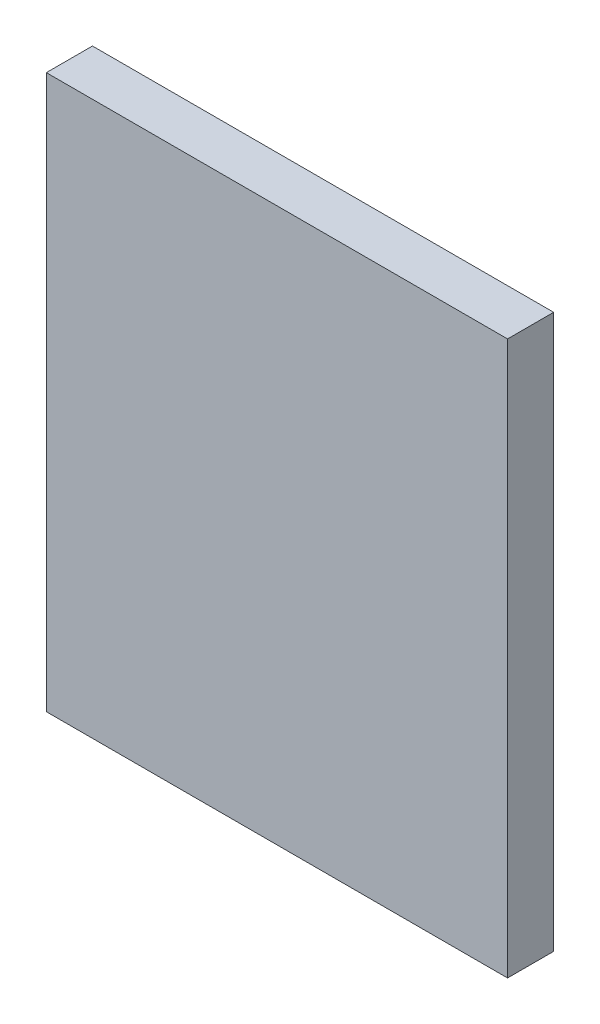
ISO-10303-21;
HEADER;
FILE_DESCRIPTION(('STEP AP214'),'2;1');
FILE_NAME('part.step','',(''),(''),'','','');
FILE_SCHEMA(('AUTOMOTIVE_DESIGN { 1 0 10303 214 1 1 1 1 }'));
ENDSEC;
DATA;
#1=APPLICATION_CONTEXT('core data for automotive mechanical design processes');
#2=APPLICATION_PROTOCOL_DEFINITION('international standard','automotive_design',2000,#1);
#3=PRODUCT_CONTEXT('',#1,'mechanical');
#4=PRODUCT('Part','Part','',(#3));
#5=PRODUCT_RELATED_PRODUCT_CATEGORY('part','',(#4));
#6=PRODUCT_DEFINITION_FORMATION('','',#4);
#7=PRODUCT_DEFINITION_CONTEXT('part definition',#1,'design');
#8=PRODUCT_DEFINITION('design','',#6,#7);
#9=PRODUCT_DEFINITION_SHAPE('','',#8);
#10=(LENGTH_UNIT() NAMED_UNIT(*) SI_UNIT(.MILLI.,.METRE.));
#11=(NAMED_UNIT(*) PLANE_ANGLE_UNIT() SI_UNIT($,.RADIAN.));
#12=(NAMED_UNIT(*) SI_UNIT($,.STERADIAN.) SOLID_ANGLE_UNIT());
#13=UNCERTAINTY_MEASURE_WITH_UNIT(LENGTH_MEASURE(1.E-05),#10,'distance_accuracy_value','');
#14=(GEOMETRIC_REPRESENTATION_CONTEXT(3) GLOBAL_UNCERTAINTY_ASSIGNED_CONTEXT((#13)) GLOBAL_UNIT_ASSIGNED_CONTEXT((#10,
#11,#12)) REPRESENTATION_CONTEXT('',''));
#15=CARTESIAN_POINT('',(0.,0.,0.));
#16=DIRECTION('',(0.,0.,1.));
#17=DIRECTION('',(1.,0.,0.));
#18=AXIS2_PLACEMENT_3D('',#15,#16,#17);
#19=CARTESIAN_POINT('',(50.,60.,0.));
#20=DIRECTION('',(0.,1.,0.));
#21=DIRECTION('',(0.,0.,1.));
#22=AXIS2_PLACEMENT_3D('',#19,#20,#21);
#23=PLANE('',#22);
#24=DIRECTION('',(-1.,0.,0.));
#25=VECTOR('',#24,1.);
#26=CARTESIAN_POINT('',(50.,60.,5.));
#27=LINE('',#26,#25);
#28=CARTESIAN_POINT('',(50.,60.,5.));
#29=VERTEX_POINT('',#28);
#30=CARTESIAN_POINT('',(0.,60.,5.));
#31=VERTEX_POINT('',#30);
#32=EDGE_CURVE('E97',#29,#31,#27,.T.);
#33=ORIENTED_EDGE('',*,*,#32,.F.);
#34=DIRECTION('',(0.,0.,1.));
#35=VECTOR('',#34,1.);
#36=CARTESIAN_POINT('',(50.,60.,0.));
#37=LINE('',#36,#35);
#38=CARTESIAN_POINT('',(50.,60.,0.));
#39=VERTEX_POINT('',#38);
#40=EDGE_CURVE('E11',#39,#29,#37,.T.);
#41=ORIENTED_EDGE('',*,*,#40,.F.);
#42=DIRECTION('',(-1.,0.,0.));
#43=VECTOR('',#42,1.);
#44=CARTESIAN_POINT('',(50.,60.,0.));
#45=LINE('',#44,#43);
#46=CARTESIAN_POINT('',(0.,60.,0.));
#47=VERTEX_POINT('',#46);
#48=EDGE_CURVE('E91',#39,#47,#45,.T.);
#49=ORIENTED_EDGE('',*,*,#48,.T.);
#50=DIRECTION('',(0.,0.,1.));
#51=VECTOR('',#50,1.);
#52=CARTESIAN_POINT('',(0.,60.,0.));
#53=LINE('',#52,#51);
#54=EDGE_CURVE('E36',#47,#31,#53,.T.);
#55=ORIENTED_EDGE('',*,*,#54,.T.);
#56=EDGE_LOOP('',(#33,#41,#49,#55));
#57=FACE_BOUND('',#56,.T.);
#58=ADVANCED_FACE('F33',(#57),#23,.T.);
#59=CARTESIAN_POINT('',(50.,0.,0.));
#60=DIRECTION('',(1.,0.,0.));
#61=DIRECTION('',(0.,0.,-1.));
#62=AXIS2_PLACEMENT_3D('',#59,#60,#61);
#63=PLANE('',#62);
#64=DIRECTION('',(0.,1.,0.));
#65=VECTOR('',#64,1.);
#66=CARTESIAN_POINT('',(50.,0.,5.));
#67=LINE('',#66,#65);
#68=CARTESIAN_POINT('',(50.,0.,5.));
#69=VERTEX_POINT('',#68);
#70=EDGE_CURVE('E93',#69,#29,#67,.T.);
#71=ORIENTED_EDGE('',*,*,#70,.F.);
#72=DIRECTION('',(0.,0.,1.));
#73=VECTOR('',#72,1.);
#74=CARTESIAN_POINT('',(50.,0.,0.));
#75=LINE('',#74,#73);
#76=CARTESIAN_POINT('',(50.,0.,0.));
#77=VERTEX_POINT('',#76);
#78=EDGE_CURVE('E42',#77,#69,#75,.T.);
#79=ORIENTED_EDGE('',*,*,#78,.F.);
#80=DIRECTION('',(0.,1.,0.));
#81=VECTOR('',#80,1.);
#82=CARTESIAN_POINT('',(50.,0.,0.));
#83=LINE('',#82,#81);
#84=EDGE_CURVE('E88',#77,#39,#83,.T.);
#85=ORIENTED_EDGE('',*,*,#84,.T.);
#86=ORIENTED_EDGE('',*,*,#40,.T.);
#87=EDGE_LOOP('',(#71,#79,#85,#86));
#88=FACE_BOUND('',#87,.T.);
#89=ADVANCED_FACE('F107',(#88),#63,.T.);
#90=CARTESIAN_POINT('',(0.,0.,0.));
#91=DIRECTION('',(0.,-1.,0.));
#92=DIRECTION('',(0.,0.,-1.));
#93=AXIS2_PLACEMENT_3D('',#90,#91,#92);
#94=PLANE('',#93);
#95=DIRECTION('',(1.,0.,0.));
#96=VECTOR('',#95,1.);
#97=CARTESIAN_POINT('',(0.,0.,5.));
#98=LINE('',#97,#96);
#99=CARTESIAN_POINT('',(0.,0.,5.));
#100=VERTEX_POINT('',#99);
#101=EDGE_CURVE('E83',#100,#69,#98,.T.);
#102=ORIENTED_EDGE('',*,*,#101,.F.);
#103=DIRECTION('',(0.,0.,1.));
#104=VECTOR('',#103,1.);
#105=CARTESIAN_POINT('',(0.,0.,0.));
#106=LINE('',#105,#104);
#107=CARTESIAN_POINT('',(0.,0.,0.));
#108=VERTEX_POINT('',#107);
#109=EDGE_CURVE('E78',#108,#100,#106,.T.);
#110=ORIENTED_EDGE('',*,*,#109,.F.);
#111=DIRECTION('',(1.,0.,0.));
#112=VECTOR('',#111,1.);
#113=CARTESIAN_POINT('',(0.,0.,0.));
#114=LINE('',#113,#112);
#115=EDGE_CURVE('E81',#108,#77,#114,.T.);
#116=ORIENTED_EDGE('',*,*,#115,.T.);
#117=ORIENTED_EDGE('',*,*,#78,.T.);
#118=EDGE_LOOP('',(#102,#110,#116,#117));
#119=FACE_BOUND('',#118,.T.);
#120=ADVANCED_FACE('F80',(#119),#94,.T.);
#121=CARTESIAN_POINT('',(0.,60.,0.));
#122=DIRECTION('',(-1.,0.,0.));
#123=DIRECTION('',(0.,0.,1.));
#124=AXIS2_PLACEMENT_3D('',#121,#122,#123);
#125=PLANE('',#124);
#126=DIRECTION('',(0.,-1.,0.));
#127=VECTOR('',#126,1.);
#128=CARTESIAN_POINT('',(0.,60.,5.));
#129=LINE('',#128,#127);
#130=EDGE_CURVE('E100',#31,#100,#129,.T.);
#131=ORIENTED_EDGE('',*,*,#130,.F.);
#132=ORIENTED_EDGE('',*,*,#54,.F.);
#133=DIRECTION('',(0.,-1.,0.));
#134=VECTOR('',#133,1.);
#135=CARTESIAN_POINT('',(0.,60.,0.));
#136=LINE('',#135,#134);
#137=EDGE_CURVE('E87',#47,#108,#136,.T.);
#138=ORIENTED_EDGE('',*,*,#137,.T.);
#139=ORIENTED_EDGE('',*,*,#109,.T.);
#140=EDGE_LOOP('',(#131,#132,#138,#139));
#141=FACE_BOUND('',#140,.T.);
#142=ADVANCED_FACE('F90',(#141),#125,.T.);
#143=CARTESIAN_POINT('',(0.,0.,0.));
#144=DIRECTION('',(0.,0.,1.));
#145=DIRECTION('',(1.,0.,0.));
#146=AXIS2_PLACEMENT_3D('',#143,#144,#145);
#147=PLANE('',#146);
#148=ORIENTED_EDGE('',*,*,#48,.F.);
#149=ORIENTED_EDGE('',*,*,#84,.F.);
#150=ORIENTED_EDGE('',*,*,#115,.F.);
#151=ORIENTED_EDGE('',*,*,#137,.F.);
#152=EDGE_LOOP('',(#148,#149,#150,#151));
#153=FACE_BOUND('',#152,.T.);
#154=ADVANCED_FACE('F86',(#153),#147,.F.);
#155=CARTESIAN_POINT('',(0.,0.,5.));
#156=DIRECTION('',(0.,0.,1.));
#157=DIRECTION('',(1.,0.,0.));
#158=AXIS2_PLACEMENT_3D('',#155,#156,#157);
#159=PLANE('',#158);
#160=ORIENTED_EDGE('',*,*,#32,.T.);
#161=ORIENTED_EDGE('',*,*,#130,.T.);
#162=ORIENTED_EDGE('',*,*,#101,.T.);
#163=ORIENTED_EDGE('',*,*,#70,.T.);
#164=EDGE_LOOP('',(#160,#161,#162,#163));
#165=FACE_BOUND('',#164,.T.);
#166=ADVANCED_FACE('F106',(#165),#159,.T.);
#167=CLOSED_SHELL('',(#58,#89,#120,#142,#154,#166));
#168=MANIFOLD_SOLID_BREP('B2',#167);
#169=ADVANCED_BREP_SHAPE_REPRESENTATION('',(#18,#168),#14);
#170=SHAPE_DEFINITION_REPRESENTATION(#9,#169);
ENDSEC;
END-ISO-10303-21;
